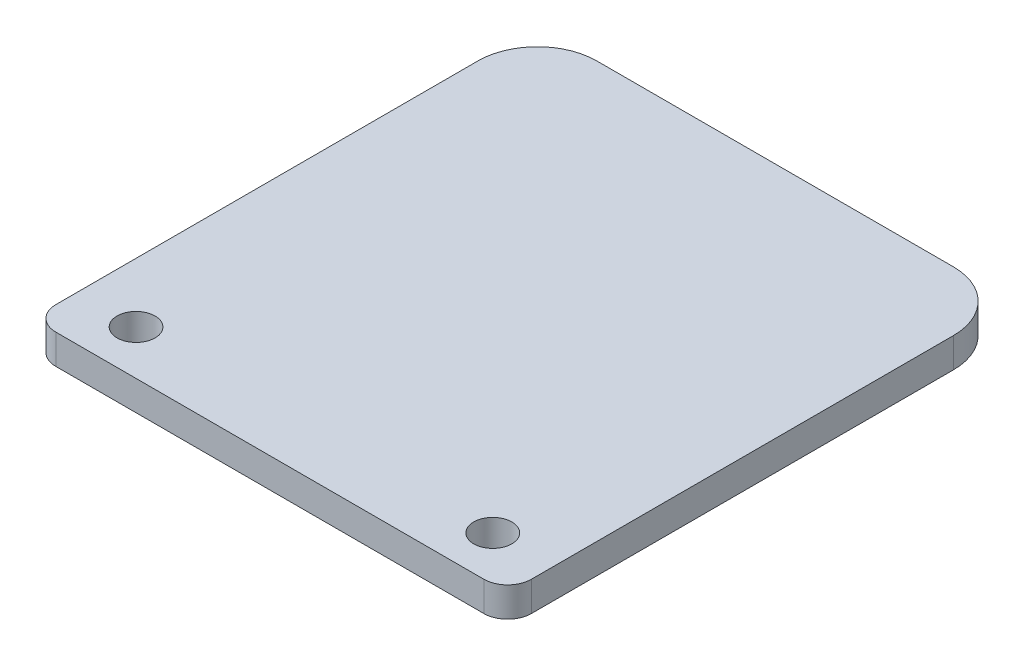
ISO-10303-21;
HEADER;
FILE_DESCRIPTION(('STEP AP214'),'2;1');
FILE_NAME('part.step','',(''),(''),'','','');
FILE_SCHEMA(('AUTOMOTIVE_DESIGN { 1 0 10303 214 1 1 1 1 }'));
ENDSEC;
DATA;
#1=APPLICATION_CONTEXT('core data for automotive mechanical design processes');
#2=APPLICATION_PROTOCOL_DEFINITION('international standard','automotive_design',2000,#1);
#3=PRODUCT_CONTEXT('',#1,'mechanical');
#4=PRODUCT('Part','Part','',(#3));
#5=PRODUCT_RELATED_PRODUCT_CATEGORY('part','',(#4));
#6=PRODUCT_DEFINITION_FORMATION('','',#4);
#7=PRODUCT_DEFINITION_CONTEXT('part definition',#1,'design');
#8=PRODUCT_DEFINITION('design','',#6,#7);
#9=PRODUCT_DEFINITION_SHAPE('','',#8);
#10=(LENGTH_UNIT() NAMED_UNIT(*) SI_UNIT(.MILLI.,.METRE.));
#11=(NAMED_UNIT(*) PLANE_ANGLE_UNIT() SI_UNIT($,.RADIAN.));
#12=(NAMED_UNIT(*) SI_UNIT($,.STERADIAN.) SOLID_ANGLE_UNIT());
#13=UNCERTAINTY_MEASURE_WITH_UNIT(LENGTH_MEASURE(1.E-05),#10,'distance_accuracy_value','');
#14=(GEOMETRIC_REPRESENTATION_CONTEXT(3) GLOBAL_UNCERTAINTY_ASSIGNED_CONTEXT((#13)) GLOBAL_UNIT_ASSIGNED_CONTEXT((#10,
#11,#12)) REPRESENTATION_CONTEXT('',''));
#15=CARTESIAN_POINT('',(0.,0.,0.));
#16=DIRECTION('',(0.,0.,1.));
#17=DIRECTION('',(1.,0.,0.));
#18=AXIS2_PLACEMENT_3D('',#15,#16,#17);
#19=CARTESIAN_POINT('',(25.4,3.175,-26.9875));
#20=DIRECTION('',(-1.,0.,0.));
#21=DIRECTION('',(0.,0.,1.));
#22=AXIS2_PLACEMENT_3D('',#19,#20,#21);
#23=PLANE('',#22);
#24=DIRECTION('',(0.,0.,-1.));
#25=VECTOR('',#24,1.);
#26=CARTESIAN_POINT('',(25.4,0.,-26.9875));
#27=LINE('',#26,#25);
#28=CARTESIAN_POINT('',(25.4,0.,24.4475));
#29=VERTEX_POINT('',#28);
#30=CARTESIAN_POINT('',(25.4,0.,-20.6375));
#31=VERTEX_POINT('',#30);
#32=EDGE_CURVE('E182',#29,#31,#27,.T.);
#33=ORIENTED_EDGE('',*,*,#32,.T.);
#34=DIRECTION('',(0.,-1.,0.));
#35=VECTOR('',#34,1.);
#36=CARTESIAN_POINT('',(25.4,3.175,-20.6375));
#37=LINE('',#36,#35);
#38=CARTESIAN_POINT('',(25.4,3.175,-20.6375));
#39=VERTEX_POINT('',#38);
#40=EDGE_CURVE('E66',#31,#39,#37,.F.);
#41=ORIENTED_EDGE('',*,*,#40,.T.);
#42=DIRECTION('',(0.,0.,-1.));
#43=VECTOR('',#42,1.);
#44=CARTESIAN_POINT('',(25.4,3.175,-26.9875));
#45=LINE('',#44,#43);
#46=CARTESIAN_POINT('',(25.4,3.175,24.4475));
#47=VERTEX_POINT('',#46);
#48=EDGE_CURVE('E138',#47,#39,#45,.T.);
#49=ORIENTED_EDGE('',*,*,#48,.F.);
#50=DIRECTION('',(0.,-1.,0.));
#51=VECTOR('',#50,1.);
#52=CARTESIAN_POINT('',(25.4,3.175,24.4475));
#53=LINE('',#52,#51);
#54=EDGE_CURVE('E156',#47,#29,#53,.T.);
#55=ORIENTED_EDGE('',*,*,#54,.T.);
#56=EDGE_LOOP('',(#33,#41,#49,#55));
#57=FACE_BOUND('',#56,.T.);
#58=ADVANCED_FACE('F43',(#57),#23,.F.);
#59=CARTESIAN_POINT('',(-25.4,3.175,-26.9875));
#60=DIRECTION('',(0.,0.,1.));
#61=DIRECTION('',(1.,0.,0.));
#62=AXIS2_PLACEMENT_3D('',#59,#60,#61);
#63=PLANE('',#62);
#64=DIRECTION('',(-1.,0.,0.));
#65=VECTOR('',#64,1.);
#66=CARTESIAN_POINT('',(-25.4,3.175,-26.9875));
#67=LINE('',#66,#65);
#68=CARTESIAN_POINT('',(19.05,3.175,-26.9875));
#69=VERTEX_POINT('',#68);
#70=CARTESIAN_POINT('',(-19.05,3.175,-26.9875));
#71=VERTEX_POINT('',#70);
#72=EDGE_CURVE('E143',#69,#71,#67,.T.);
#73=ORIENTED_EDGE('',*,*,#72,.F.);
#74=DIRECTION('',(0.,-1.,0.));
#75=VECTOR('',#74,1.);
#76=CARTESIAN_POINT('',(19.05,3.175,-26.9875));
#77=LINE('',#76,#75);
#78=CARTESIAN_POINT('',(19.05,0.,-26.9875));
#79=VERTEX_POINT('',#78);
#80=EDGE_CURVE('E161',#69,#79,#77,.T.);
#81=ORIENTED_EDGE('',*,*,#80,.T.);
#82=DIRECTION('',(-1.,0.,0.));
#83=VECTOR('',#82,1.);
#84=CARTESIAN_POINT('',(-25.4,0.,-26.9875));
#85=LINE('',#84,#83);
#86=CARTESIAN_POINT('',(-19.05,0.,-26.9875));
#87=VERTEX_POINT('',#86);
#88=EDGE_CURVE('E145',#79,#87,#85,.T.);
#89=ORIENTED_EDGE('',*,*,#88,.T.);
#90=DIRECTION('',(0.,-1.,0.));
#91=VECTOR('',#90,1.);
#92=CARTESIAN_POINT('',(-19.05,3.175,-26.9875));
#93=LINE('',#92,#91);
#94=EDGE_CURVE('E159',#87,#71,#93,.F.);
#95=ORIENTED_EDGE('',*,*,#94,.T.);
#96=EDGE_LOOP('',(#73,#81,#89,#95));
#97=FACE_BOUND('',#96,.T.);
#98=ADVANCED_FACE('F175',(#97),#63,.F.);
#99=CARTESIAN_POINT('',(-25.4,3.175,-26.9875));
#100=DIRECTION('',(1.,0.,0.));
#101=DIRECTION('',(0.,0.,-1.));
#102=AXIS2_PLACEMENT_3D('',#99,#100,#101);
#103=PLANE('',#102);
#104=DIRECTION('',(0.,0.,1.));
#105=VECTOR('',#104,1.);
#106=CARTESIAN_POINT('',(-25.4,3.175,-26.9875));
#107=LINE('',#106,#105);
#108=CARTESIAN_POINT('',(-25.4,3.175,-20.6375));
#109=VERTEX_POINT('',#108);
#110=CARTESIAN_POINT('',(-25.4,3.175,24.4475));
#111=VERTEX_POINT('',#110);
#112=EDGE_CURVE('E179',#109,#111,#107,.T.);
#113=ORIENTED_EDGE('',*,*,#112,.F.);
#114=DIRECTION('',(0.,-1.,0.));
#115=VECTOR('',#114,1.);
#116=CARTESIAN_POINT('',(-25.4,3.175,-20.6375));
#117=LINE('',#116,#115);
#118=CARTESIAN_POINT('',(-25.4,0.,-20.6375));
#119=VERTEX_POINT('',#118);
#120=EDGE_CURVE('E11',#109,#119,#117,.T.);
#121=ORIENTED_EDGE('',*,*,#120,.T.);
#122=DIRECTION('',(0.,0.,1.));
#123=VECTOR('',#122,1.);
#124=CARTESIAN_POINT('',(-25.4,0.,-26.9875));
#125=LINE('',#124,#123);
#126=CARTESIAN_POINT('',(-25.4,0.,24.4475));
#127=VERTEX_POINT('',#126);
#128=EDGE_CURVE('E139',#119,#127,#125,.T.);
#129=ORIENTED_EDGE('',*,*,#128,.T.);
#130=DIRECTION('',(0.,-1.,0.));
#131=VECTOR('',#130,1.);
#132=CARTESIAN_POINT('',(-25.4,3.175,24.4475));
#133=LINE('',#132,#131);
#134=EDGE_CURVE('E118',#127,#111,#133,.F.);
#135=ORIENTED_EDGE('',*,*,#134,.T.);
#136=EDGE_LOOP('',(#113,#121,#129,#135));
#137=FACE_BOUND('',#136,.T.);
#138=ADVANCED_FACE('F228',(#137),#103,.F.);
#139=CARTESIAN_POINT('',(-25.4,3.175,26.9875));
#140=DIRECTION('',(0.,0.,-1.));
#141=DIRECTION('',(-1.,0.,0.));
#142=AXIS2_PLACEMENT_3D('',#139,#140,#141);
#143=PLANE('',#142);
#144=DIRECTION('',(1.,0.,0.));
#145=VECTOR('',#144,1.);
#146=CARTESIAN_POINT('',(-25.4,3.175,26.9875));
#147=LINE('',#146,#145);
#148=CARTESIAN_POINT('',(-22.86,3.175,26.9875));
#149=VERTEX_POINT('',#148);
#150=CARTESIAN_POINT('',(22.86,3.175,26.9875));
#151=VERTEX_POINT('',#150);
#152=EDGE_CURVE('E131',#149,#151,#147,.T.);
#153=ORIENTED_EDGE('',*,*,#152,.F.);
#154=DIRECTION('',(0.,-1.,0.));
#155=VECTOR('',#154,1.);
#156=CARTESIAN_POINT('',(-22.86,3.175,26.9875));
#157=LINE('',#156,#155);
#158=CARTESIAN_POINT('',(-22.86,0.,26.9875));
#159=VERTEX_POINT('',#158);
#160=EDGE_CURVE('E116',#149,#159,#157,.T.);
#161=ORIENTED_EDGE('',*,*,#160,.T.);
#162=DIRECTION('',(1.,0.,0.));
#163=VECTOR('',#162,1.);
#164=CARTESIAN_POINT('',(-25.4,0.,26.9875));
#165=LINE('',#164,#163);
#166=CARTESIAN_POINT('',(22.86,0.,26.9875));
#167=VERTEX_POINT('',#166);
#168=EDGE_CURVE('E128',#159,#167,#165,.T.);
#169=ORIENTED_EDGE('',*,*,#168,.T.);
#170=DIRECTION('',(0.,-1.,0.));
#171=VECTOR('',#170,1.);
#172=CARTESIAN_POINT('',(22.86,3.175,26.9875));
#173=LINE('',#172,#171);
#174=EDGE_CURVE('E132',#167,#151,#173,.F.);
#175=ORIENTED_EDGE('',*,*,#174,.T.);
#176=EDGE_LOOP('',(#153,#161,#169,#175));
#177=FACE_BOUND('',#176,.T.);
#178=ADVANCED_FACE('F127',(#177),#143,.F.);
#179=CARTESIAN_POINT('',(0.,3.175,0.));
#180=DIRECTION('',(0.,1.,0.));
#181=DIRECTION('',(0.,0.,1.));
#182=AXIS2_PLACEMENT_3D('',#179,#180,#181);
#183=PLANE('',#182);
#184=CARTESIAN_POINT('',(19.05,3.175,22.225));
#185=DIRECTION('',(0.,-1.,0.));
#186=DIRECTION('',(0.,0.,-1.));
#187=AXIS2_PLACEMENT_3D('',#184,#185,#186);
#188=CIRCLE('',#187,2.032);
#189=CARTESIAN_POINT('',(19.05,3.175,20.193));
#190=VERTEX_POINT('',#189);
#191=EDGE_CURVE('E184',#190,#190,#188,.T.);
#192=ORIENTED_EDGE('',*,*,#191,.T.);
#193=EDGE_LOOP('',(#192));
#194=FACE_BOUND('',#193,.T.);
#195=CARTESIAN_POINT('',(-19.05,3.175,22.225));
#196=DIRECTION('',(0.,-1.,0.));
#197=DIRECTION('',(0.,0.,-1.));
#198=AXIS2_PLACEMENT_3D('',#195,#196,#197);
#199=CIRCLE('',#198,2.032);
#200=CARTESIAN_POINT('',(-19.05,3.175,20.193));
#201=VERTEX_POINT('',#200);
#202=EDGE_CURVE('E193',#201,#201,#199,.T.);
#203=ORIENTED_EDGE('',*,*,#202,.T.);
#204=EDGE_LOOP('',(#203));
#205=FACE_BOUND('',#204,.T.);
#206=ORIENTED_EDGE('',*,*,#48,.T.);
#207=CARTESIAN_POINT('',(19.05,3.175,-20.6375));
#208=DIRECTION('',(0.,1.,0.));
#209=DIRECTION('',(0.,0.,1.));
#210=AXIS2_PLACEMENT_3D('',#207,#208,#209);
#211=CIRCLE('',#210,6.35);
#212=EDGE_CURVE('E51',#39,#69,#211,.T.);
#213=ORIENTED_EDGE('',*,*,#212,.T.);
#214=ORIENTED_EDGE('',*,*,#72,.T.);
#215=CARTESIAN_POINT('',(-19.05,3.175,-20.6375));
#216=DIRECTION('',(0.,1.,0.));
#217=DIRECTION('',(0.,0.,1.));
#218=AXIS2_PLACEMENT_3D('',#215,#216,#217);
#219=CIRCLE('',#218,6.35);
#220=EDGE_CURVE('E58',#71,#109,#219,.T.);
#221=ORIENTED_EDGE('',*,*,#220,.T.);
#222=ORIENTED_EDGE('',*,*,#112,.T.);
#223=CARTESIAN_POINT('',(-22.86,3.175,24.4475));
#224=DIRECTION('',(0.,1.,0.));
#225=DIRECTION('',(0.,0.,1.));
#226=AXIS2_PLACEMENT_3D('',#223,#224,#225);
#227=CIRCLE('',#226,2.54);
#228=EDGE_CURVE('E154',#111,#149,#227,.T.);
#229=ORIENTED_EDGE('',*,*,#228,.T.);
#230=ORIENTED_EDGE('',*,*,#152,.T.);
#231=CARTESIAN_POINT('',(22.86,3.175,24.4475));
#232=DIRECTION('',(0.,1.,0.));
#233=DIRECTION('',(0.,0.,1.));
#234=AXIS2_PLACEMENT_3D('',#231,#232,#233);
#235=CIRCLE('',#234,2.54);
#236=EDGE_CURVE('E152',#151,#47,#235,.T.);
#237=ORIENTED_EDGE('',*,*,#236,.T.);
#238=EDGE_LOOP('',(#206,#213,#214,#221,#222,#229,#230,#237));
#239=FACE_BOUND('',#238,.T.);
#240=ADVANCED_FACE('F171',(#194,#205,#239),#183,.T.);
#241=CARTESIAN_POINT('',(0.,0.,0.));
#242=DIRECTION('',(0.,1.,0.));
#243=DIRECTION('',(0.,0.,1.));
#244=AXIS2_PLACEMENT_3D('',#241,#242,#243);
#245=PLANE('',#244);
#246=CARTESIAN_POINT('',(19.05,0.,22.225));
#247=DIRECTION('',(0.,-1.,0.));
#248=DIRECTION('',(0.,0.,-1.));
#249=AXIS2_PLACEMENT_3D('',#246,#247,#248);
#250=CIRCLE('',#249,2.032);
#251=CARTESIAN_POINT('',(19.05,0.,20.193));
#252=VERTEX_POINT('',#251);
#253=EDGE_CURVE('E188',#252,#252,#250,.T.);
#254=ORIENTED_EDGE('',*,*,#253,.F.);
#255=EDGE_LOOP('',(#254));
#256=FACE_BOUND('',#255,.T.);
#257=CARTESIAN_POINT('',(-19.05,0.,22.225));
#258=DIRECTION('',(0.,-1.,0.));
#259=DIRECTION('',(0.,0.,-1.));
#260=AXIS2_PLACEMENT_3D('',#257,#258,#259);
#261=CIRCLE('',#260,2.032);
#262=CARTESIAN_POINT('',(-19.05,0.,20.193));
#263=VERTEX_POINT('',#262);
#264=EDGE_CURVE('E196',#263,#263,#261,.T.);
#265=ORIENTED_EDGE('',*,*,#264,.F.);
#266=EDGE_LOOP('',(#265));
#267=FACE_BOUND('',#266,.T.);
#268=ORIENTED_EDGE('',*,*,#88,.F.);
#269=CARTESIAN_POINT('',(19.05,0.,-20.6375));
#270=DIRECTION('',(0.,1.,0.));
#271=DIRECTION('',(0.,0.,1.));
#272=AXIS2_PLACEMENT_3D('',#269,#270,#271);
#273=CIRCLE('',#272,6.35);
#274=EDGE_CURVE('E166',#79,#31,#273,.F.);
#275=ORIENTED_EDGE('',*,*,#274,.T.);
#276=ORIENTED_EDGE('',*,*,#32,.F.);
#277=CARTESIAN_POINT('',(22.86,0.,24.4475));
#278=DIRECTION('',(0.,1.,0.));
#279=DIRECTION('',(0.,0.,1.));
#280=AXIS2_PLACEMENT_3D('',#277,#278,#279);
#281=CIRCLE('',#280,2.54);
#282=EDGE_CURVE('E122',#29,#167,#281,.F.);
#283=ORIENTED_EDGE('',*,*,#282,.T.);
#284=ORIENTED_EDGE('',*,*,#168,.F.);
#285=CARTESIAN_POINT('',(-22.86,0.,24.4475));
#286=DIRECTION('',(0.,1.,0.));
#287=DIRECTION('',(0.,0.,1.));
#288=AXIS2_PLACEMENT_3D('',#285,#286,#287);
#289=CIRCLE('',#288,2.54);
#290=EDGE_CURVE('E112',#159,#127,#289,.F.);
#291=ORIENTED_EDGE('',*,*,#290,.T.);
#292=ORIENTED_EDGE('',*,*,#128,.F.);
#293=CARTESIAN_POINT('',(-19.05,0.,-20.6375));
#294=DIRECTION('',(0.,1.,0.));
#295=DIRECTION('',(0.,0.,1.));
#296=AXIS2_PLACEMENT_3D('',#293,#294,#295);
#297=CIRCLE('',#296,6.35);
#298=EDGE_CURVE('E164',#119,#87,#297,.F.);
#299=ORIENTED_EDGE('',*,*,#298,.T.);
#300=EDGE_LOOP('',(#268,#275,#276,#283,#284,#291,#292,#299));
#301=FACE_BOUND('',#300,.T.);
#302=ADVANCED_FACE('F135',(#256,#267,#301),#245,.F.);
#303=CARTESIAN_POINT('',(-19.05,3.175,22.225));
#304=DIRECTION('',(0.,-1.,0.));
#305=DIRECTION('',(0.,0.,-1.));
#306=AXIS2_PLACEMENT_3D('',#303,#304,#305);
#307=CYLINDRICAL_SURFACE('',#306,2.032);
#308=ORIENTED_EDGE('',*,*,#202,.F.);
#309=EDGE_LOOP('',(#308));
#310=FACE_BOUND('',#309,.T.);
#311=ORIENTED_EDGE('',*,*,#264,.T.);
#312=EDGE_LOOP('',(#311));
#313=FACE_BOUND('',#312,.T.);
#314=ADVANCED_FACE('F207',(#310,#313),#307,.F.);
#315=CARTESIAN_POINT('',(19.05,3.175,22.225));
#316=DIRECTION('',(0.,-1.,0.));
#317=DIRECTION('',(0.,0.,-1.));
#318=AXIS2_PLACEMENT_3D('',#315,#316,#317);
#319=CYLINDRICAL_SURFACE('',#318,2.032);
#320=ORIENTED_EDGE('',*,*,#191,.F.);
#321=EDGE_LOOP('',(#320));
#322=FACE_BOUND('',#321,.T.);
#323=ORIENTED_EDGE('',*,*,#253,.T.);
#324=EDGE_LOOP('',(#323));
#325=FACE_BOUND('',#324,.T.);
#326=ADVANCED_FACE('F203',(#322,#325),#319,.F.);
#327=CARTESIAN_POINT('',(-22.86,3.175,24.4475));
#328=DIRECTION('',(0.,-1.,0.));
#329=DIRECTION('',(0.,0.,-1.));
#330=AXIS2_PLACEMENT_3D('',#327,#328,#329);
#331=CYLINDRICAL_SURFACE('',#330,2.54);
#332=ORIENTED_EDGE('',*,*,#228,.F.);
#333=ORIENTED_EDGE('',*,*,#134,.F.);
#334=ORIENTED_EDGE('',*,*,#290,.F.);
#335=ORIENTED_EDGE('',*,*,#160,.F.);
#336=EDGE_LOOP('',(#332,#333,#334,#335));
#337=FACE_BOUND('',#336,.T.);
#338=ADVANCED_FACE('F115',(#337),#331,.T.);
#339=CARTESIAN_POINT('',(22.86,3.175,24.4475));
#340=DIRECTION('',(0.,-1.,0.));
#341=DIRECTION('',(0.,0.,-1.));
#342=AXIS2_PLACEMENT_3D('',#339,#340,#341);
#343=CYLINDRICAL_SURFACE('',#342,2.54);
#344=ORIENTED_EDGE('',*,*,#236,.F.);
#345=ORIENTED_EDGE('',*,*,#174,.F.);
#346=ORIENTED_EDGE('',*,*,#282,.F.);
#347=ORIENTED_EDGE('',*,*,#54,.F.);
#348=EDGE_LOOP('',(#344,#345,#346,#347));
#349=FACE_BOUND('',#348,.T.);
#350=ADVANCED_FACE('F234',(#349),#343,.T.);
#351=CARTESIAN_POINT('',(19.05,3.175,-20.6375));
#352=DIRECTION('',(0.,-1.,0.));
#353=DIRECTION('',(0.,0.,-1.));
#354=AXIS2_PLACEMENT_3D('',#351,#352,#353);
#355=CYLINDRICAL_SURFACE('',#354,6.35);
#356=ORIENTED_EDGE('',*,*,#212,.F.);
#357=ORIENTED_EDGE('',*,*,#40,.F.);
#358=ORIENTED_EDGE('',*,*,#274,.F.);
#359=ORIENTED_EDGE('',*,*,#80,.F.);
#360=EDGE_LOOP('',(#356,#357,#358,#359));
#361=FACE_BOUND('',#360,.T.);
#362=ADVANCED_FACE('F181',(#361),#355,.T.);
#363=CARTESIAN_POINT('',(-19.05,3.175,-20.6375));
#364=DIRECTION('',(0.,-1.,0.));
#365=DIRECTION('',(0.,0.,-1.));
#366=AXIS2_PLACEMENT_3D('',#363,#364,#365);
#367=CYLINDRICAL_SURFACE('',#366,6.35);
#368=ORIENTED_EDGE('',*,*,#220,.F.);
#369=ORIENTED_EDGE('',*,*,#94,.F.);
#370=ORIENTED_EDGE('',*,*,#298,.F.);
#371=ORIENTED_EDGE('',*,*,#120,.F.);
#372=EDGE_LOOP('',(#368,#369,#370,#371));
#373=FACE_BOUND('',#372,.T.);
#374=ADVANCED_FACE('F45',(#373),#367,.T.);
#375=CLOSED_SHELL('',(#58,#98,#138,#178,#240,#302,#314,#326,#338,#350,#362,#374));
#376=MANIFOLD_SOLID_BREP('B2',#375);
#377=ADVANCED_BREP_SHAPE_REPRESENTATION('',(#18,#376),#14);
#378=SHAPE_DEFINITION_REPRESENTATION(#9,#377);
ENDSEC;
END-ISO-10303-21;
